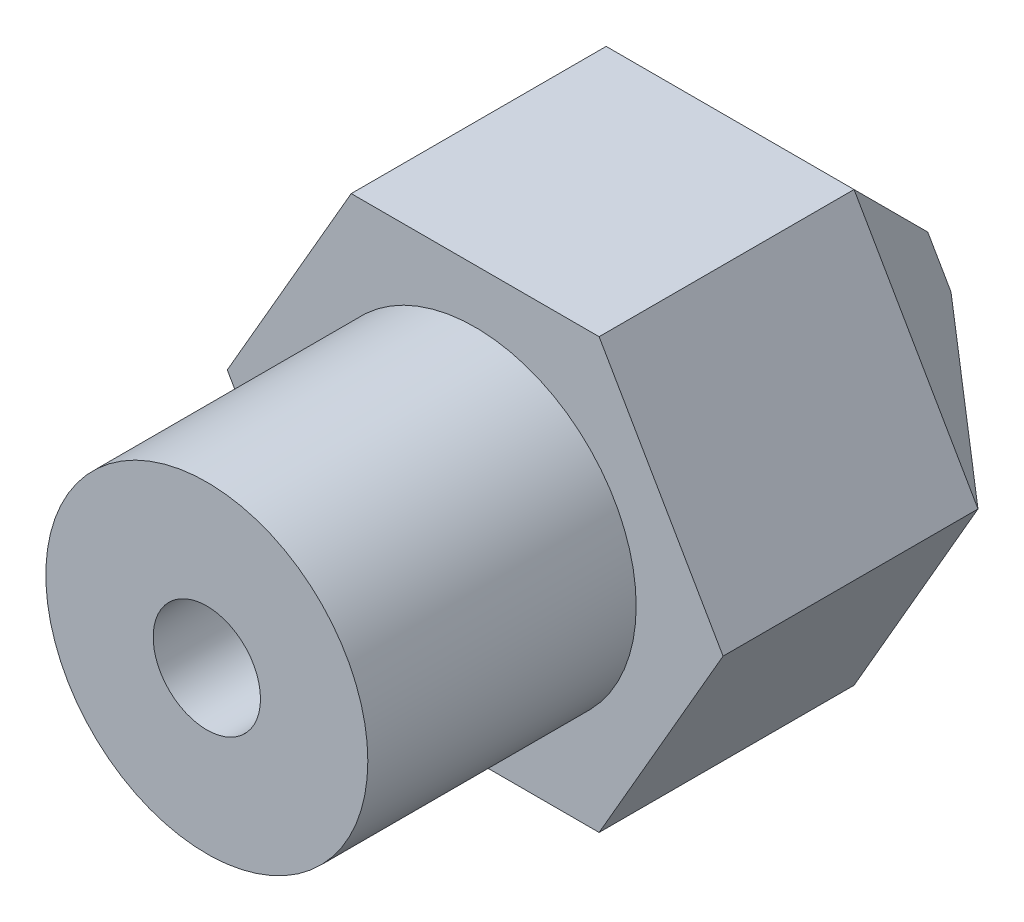
ISO-10303-21;
HEADER;
FILE_DESCRIPTION(('STEP AP214'),'2;1');
FILE_NAME('part.step','',(''),(''),'','','');
FILE_SCHEMA(('AUTOMOTIVE_DESIGN { 1 0 10303 214 1 1 1 1 }'));
ENDSEC;
DATA;
#1=APPLICATION_CONTEXT('core data for automotive mechanical design processes');
#2=APPLICATION_PROTOCOL_DEFINITION('international standard','automotive_design',2000,#1);
#3=PRODUCT_CONTEXT('',#1,'mechanical');
#4=PRODUCT('Part','Part','',(#3));
#5=PRODUCT_RELATED_PRODUCT_CATEGORY('part','',(#4));
#6=PRODUCT_DEFINITION_FORMATION('','',#4);
#7=PRODUCT_DEFINITION_CONTEXT('part definition',#1,'design');
#8=PRODUCT_DEFINITION('design','',#6,#7);
#9=PRODUCT_DEFINITION_SHAPE('','',#8);
#10=(LENGTH_UNIT() NAMED_UNIT(*) SI_UNIT(.MILLI.,.METRE.));
#11=(NAMED_UNIT(*) PLANE_ANGLE_UNIT() SI_UNIT($,.RADIAN.));
#12=(NAMED_UNIT(*) SI_UNIT($,.STERADIAN.) SOLID_ANGLE_UNIT());
#13=UNCERTAINTY_MEASURE_WITH_UNIT(LENGTH_MEASURE(1.E-05),#10,'distance_accuracy_value','');
#14=(GEOMETRIC_REPRESENTATION_CONTEXT(3) GLOBAL_UNCERTAINTY_ASSIGNED_CONTEXT((#13)) GLOBAL_UNIT_ASSIGNED_CONTEXT((#10,
#11,#12)) REPRESENTATION_CONTEXT('',''));
#15=CARTESIAN_POINT('',(0.,0.,0.));
#16=DIRECTION('',(0.,0.,1.));
#17=DIRECTION('',(1.,0.,0.));
#18=AXIS2_PLACEMENT_3D('',#15,#16,#17);
#19=CARTESIAN_POINT('',(2.30940107675855,-3.99999999999998,13.));
#20=DIRECTION('',(-0.866025403784442,0.499999999999995,0.));
#21=DIRECTION('',(-0.499999999999995,-0.866025403784442,0.));
#22=AXIS2_PLACEMENT_3D('',#19,#20,#21);
#23=PLANE('',#22);
#24=DIRECTION('',(0.,0.,-1.));
#25=VECTOR('',#24,1.);
#26=CARTESIAN_POINT('',(2.30940107675855,-3.99999999999998,13.));
#27=LINE('',#26,#25);
#28=CARTESIAN_POINT('',(2.30940107675855,-3.99999999999998,8.));
#29=VERTEX_POINT('',#28);
#30=CARTESIAN_POINT('',(2.30940107675855,-3.99999999999998,3.25));
#31=VERTEX_POINT('',#30);
#32=EDGE_CURVE('E120',#29,#31,#27,.T.);
#33=ORIENTED_EDGE('',*,*,#32,.T.);
#34=DIRECTION('',(0.499999999999995,0.866025403784442,0.));
#35=VECTOR('',#34,1.);
#36=CARTESIAN_POINT('',(2.30940107675855,-3.99999999999998,3.25));
#37=LINE('',#36,#35);
#38=CARTESIAN_POINT('',(4.61880215351701,0.,3.25));
#39=VERTEX_POINT('',#38);
#40=EDGE_CURVE('E11',#31,#39,#37,.T.);
#41=ORIENTED_EDGE('',*,*,#40,.T.);
#42=DIRECTION('',(0.,0.,-1.));
#43=VECTOR('',#42,1.);
#44=CARTESIAN_POINT('',(4.61880215351701,0.,13.));
#45=LINE('',#44,#43);
#46=CARTESIAN_POINT('',(4.61880215351701,0.,8.));
#47=VERTEX_POINT('',#46);
#48=EDGE_CURVE('E116',#47,#39,#45,.T.);
#49=ORIENTED_EDGE('',*,*,#48,.F.);
#50=DIRECTION('',(0.499999999999995,0.866025403784442,0.));
#51=VECTOR('',#50,1.);
#52=CARTESIAN_POINT('',(2.30940107675855,-3.99999999999998,8.));
#53=LINE('',#52,#51);
#54=EDGE_CURVE('E111',#29,#47,#53,.T.);
#55=ORIENTED_EDGE('',*,*,#54,.F.);
#56=EDGE_LOOP('',(#33,#41,#49,#55));
#57=FACE_BOUND('',#56,.T.);
#58=ADVANCED_FACE('F35',(#57),#23,.F.);
#59=CARTESIAN_POINT('',(4.61880215351701,0.,13.));
#60=DIRECTION('',(-0.866025403784438,-0.500000000000001,0.));
#61=DIRECTION('',(0.500000000000001,-0.866025403784438,0.));
#62=AXIS2_PLACEMENT_3D('',#59,#60,#61);
#63=PLANE('',#62);
#64=ORIENTED_EDGE('',*,*,#48,.T.);
#65=DIRECTION('',(-0.500000000000001,0.866025403784438,0.));
#66=VECTOR('',#65,1.);
#67=CARTESIAN_POINT('',(4.61880215351701,0.,3.25));
#68=LINE('',#67,#66);
#69=CARTESIAN_POINT('',(2.3094010767585,4.00000000000001,3.25));
#70=VERTEX_POINT('',#69);
#71=EDGE_CURVE('E115',#39,#70,#68,.T.);
#72=ORIENTED_EDGE('',*,*,#71,.T.);
#73=DIRECTION('',(0.,0.,-1.));
#74=VECTOR('',#73,1.);
#75=CARTESIAN_POINT('',(2.3094010767585,4.00000000000001,13.));
#76=LINE('',#75,#74);
#77=CARTESIAN_POINT('',(2.3094010767585,4.00000000000001,8.));
#78=VERTEX_POINT('',#77);
#79=EDGE_CURVE('E136',#78,#70,#76,.T.);
#80=ORIENTED_EDGE('',*,*,#79,.F.);
#81=DIRECTION('',(-0.500000000000001,0.866025403784438,0.));
#82=VECTOR('',#81,1.);
#83=CARTESIAN_POINT('',(4.61880215351701,0.,8.));
#84=LINE('',#83,#82);
#85=EDGE_CURVE('E123',#47,#78,#84,.T.);
#86=ORIENTED_EDGE('',*,*,#85,.F.);
#87=EDGE_LOOP('',(#64,#72,#80,#86));
#88=FACE_BOUND('',#87,.T.);
#89=ADVANCED_FACE('F200',(#88),#63,.F.);
#90=CARTESIAN_POINT('',(2.3094010767585,4.00000000000001,13.));
#91=DIRECTION('',(0.,-1.,0.));
#92=DIRECTION('',(1.,0.,0.));
#93=AXIS2_PLACEMENT_3D('',#90,#91,#92);
#94=PLANE('',#93);
#95=ORIENTED_EDGE('',*,*,#79,.T.);
#96=DIRECTION('',(-1.,0.,0.));
#97=VECTOR('',#96,1.);
#98=CARTESIAN_POINT('',(2.3094010767585,4.00000000000001,3.25));
#99=LINE('',#98,#97);
#100=CARTESIAN_POINT('',(-2.30940107675852,3.99999999999999,3.25));
#101=VERTEX_POINT('',#100);
#102=EDGE_CURVE('E155',#70,#101,#99,.T.);
#103=ORIENTED_EDGE('',*,*,#102,.T.);
#104=DIRECTION('',(0.,0.,-1.));
#105=VECTOR('',#104,1.);
#106=CARTESIAN_POINT('',(-2.30940107675852,3.99999999999999,13.));
#107=LINE('',#106,#105);
#108=CARTESIAN_POINT('',(-2.30940107675852,3.99999999999999,8.));
#109=VERTEX_POINT('',#108);
#110=EDGE_CURVE('E133',#109,#101,#107,.T.);
#111=ORIENTED_EDGE('',*,*,#110,.F.);
#112=DIRECTION('',(-1.,0.,0.));
#113=VECTOR('',#112,1.);
#114=CARTESIAN_POINT('',(2.3094010767585,4.00000000000001,8.));
#115=LINE('',#114,#113);
#116=EDGE_CURVE('E192',#78,#109,#115,.T.);
#117=ORIENTED_EDGE('',*,*,#116,.F.);
#118=EDGE_LOOP('',(#95,#103,#111,#117));
#119=FACE_BOUND('',#118,.T.);
#120=ADVANCED_FACE('F199',(#119),#94,.F.);
#121=CARTESIAN_POINT('',(-2.30940107675852,3.99999999999999,13.));
#122=DIRECTION('',(0.866025403784441,-0.499999999999995,0.));
#123=DIRECTION('',(0.499999999999995,0.866025403784442,0.));
#124=AXIS2_PLACEMENT_3D('',#121,#122,#123);
#125=PLANE('',#124);
#126=ORIENTED_EDGE('',*,*,#110,.T.);
#127=DIRECTION('',(-0.499999999999995,-0.866025403784442,0.));
#128=VECTOR('',#127,1.);
#129=CARTESIAN_POINT('',(-2.30940107675852,3.99999999999999,3.25));
#130=LINE('',#129,#128);
#131=CARTESIAN_POINT('',(-4.61880215351701,0.,3.25));
#132=VERTEX_POINT('',#131);
#133=EDGE_CURVE('E157',#101,#132,#130,.T.);
#134=ORIENTED_EDGE('',*,*,#133,.T.);
#135=DIRECTION('',(0.,0.,-1.));
#136=VECTOR('',#135,1.);
#137=CARTESIAN_POINT('',(-4.61880215351701,0.,13.));
#138=LINE('',#137,#136);
#139=CARTESIAN_POINT('',(-4.61880215351701,0.,8.));
#140=VERTEX_POINT('',#139);
#141=EDGE_CURVE('E128',#140,#132,#138,.T.);
#142=ORIENTED_EDGE('',*,*,#141,.F.);
#143=DIRECTION('',(-0.499999999999995,-0.866025403784442,0.));
#144=VECTOR('',#143,1.);
#145=CARTESIAN_POINT('',(-2.30940107675852,3.99999999999999,8.));
#146=LINE('',#145,#144);
#147=EDGE_CURVE('E190',#109,#140,#146,.T.);
#148=ORIENTED_EDGE('',*,*,#147,.F.);
#149=EDGE_LOOP('',(#126,#134,#142,#148));
#150=FACE_BOUND('',#149,.T.);
#151=ADVANCED_FACE('F215',(#150),#125,.F.);
#152=CARTESIAN_POINT('',(-4.61880215351701,0.,13.));
#153=DIRECTION('',(0.866025403784434,0.500000000000007,0.));
#154=DIRECTION('',(-0.500000000000007,0.866025403784435,0.));
#155=AXIS2_PLACEMENT_3D('',#152,#153,#154);
#156=PLANE('',#155);
#157=ORIENTED_EDGE('',*,*,#141,.T.);
#158=DIRECTION('',(0.500000000000007,-0.866025403784435,0.));
#159=VECTOR('',#158,1.);
#160=CARTESIAN_POINT('',(-4.61880215351701,0.,3.25));
#161=LINE('',#160,#159);
#162=CARTESIAN_POINT('',(-2.30940107675847,-4.00000000000002,3.25));
#163=VERTEX_POINT('',#162);
#164=EDGE_CURVE('E59',#132,#163,#161,.T.);
#165=ORIENTED_EDGE('',*,*,#164,.T.);
#166=DIRECTION('',(0.,0.,-1.));
#167=VECTOR('',#166,1.);
#168=CARTESIAN_POINT('',(-2.30940107675847,-4.00000000000002,13.));
#169=LINE('',#168,#167);
#170=CARTESIAN_POINT('',(-2.30940107675847,-4.00000000000002,8.));
#171=VERTEX_POINT('',#170);
#172=EDGE_CURVE('E126',#171,#163,#169,.T.);
#173=ORIENTED_EDGE('',*,*,#172,.F.);
#174=DIRECTION('',(0.500000000000007,-0.866025403784435,0.));
#175=VECTOR('',#174,1.);
#176=CARTESIAN_POINT('',(-4.61880215351701,0.,8.));
#177=LINE('',#176,#175);
#178=EDGE_CURVE('E114',#140,#171,#177,.T.);
#179=ORIENTED_EDGE('',*,*,#178,.F.);
#180=EDGE_LOOP('',(#157,#165,#173,#179));
#181=FACE_BOUND('',#180,.T.);
#182=ADVANCED_FACE('F239',(#181),#156,.F.);
#183=CARTESIAN_POINT('',(-2.30940107675847,-4.00000000000002,13.));
#184=DIRECTION('',(0.,1.,0.));
#185=DIRECTION('',(-1.,0.,0.));
#186=AXIS2_PLACEMENT_3D('',#183,#184,#185);
#187=PLANE('',#186);
#188=ORIENTED_EDGE('',*,*,#172,.T.);
#189=DIRECTION('',(1.,0.,0.));
#190=VECTOR('',#189,1.);
#191=CARTESIAN_POINT('',(-2.30940107675847,-4.00000000000002,3.25));
#192=LINE('',#191,#190);
#193=EDGE_CURVE('E44',#163,#31,#192,.T.);
#194=ORIENTED_EDGE('',*,*,#193,.T.);
#195=ORIENTED_EDGE('',*,*,#32,.F.);
#196=DIRECTION('',(1.,0.,0.));
#197=VECTOR('',#196,1.);
#198=CARTESIAN_POINT('',(-2.30940107675847,-4.00000000000002,8.));
#199=LINE('',#198,#197);
#200=EDGE_CURVE('E108',#171,#29,#199,.T.);
#201=ORIENTED_EDGE('',*,*,#200,.F.);
#202=EDGE_LOOP('',(#188,#194,#195,#201));
#203=FACE_BOUND('',#202,.T.);
#204=ADVANCED_FACE('F125',(#203),#187,.F.);
#205=CARTESIAN_POINT('',(0.,0.,0.));
#206=DIRECTION('',(0.,0.,1.));
#207=DIRECTION('',(1.,0.,0.));
#208=AXIS2_PLACEMENT_3D('',#205,#206,#207);
#209=PLANE('',#208);
#210=CARTESIAN_POINT('',(0.,0.,0.));
#211=DIRECTION('',(0.,0.,-1.));
#212=DIRECTION('',(-1.,0.,0.));
#213=AXIS2_PLACEMENT_3D('',#210,#211,#212);
#214=CIRCLE('',#213,0.2);
#215=CARTESIAN_POINT('',(-0.2,0.,0.));
#216=VERTEX_POINT('',#215);
#217=EDGE_CURVE('E297',#216,#216,#214,.T.);
#218=ORIENTED_EDGE('',*,*,#217,.F.);
#219=EDGE_LOOP('',(#218));
#220=FACE_BOUND('',#219,.T.);
#221=DIRECTION('',(1.,0.,0.));
#222=VECTOR('',#221,1.);
#223=CARTESIAN_POINT('',(0.,0.74999999999999,0.));
#224=LINE('',#223,#222);
#225=CARTESIAN_POINT('',(-0.433012701892217,0.749999999999988,0.));
#226=VERTEX_POINT('',#225);
#227=CARTESIAN_POINT('',(0.433012701892211,0.749999999999991,0.));
#228=VERTEX_POINT('',#227);
#229=EDGE_CURVE('E150',#226,#228,#224,.T.);
#230=ORIENTED_EDGE('',*,*,#229,.T.);
#231=DIRECTION('',(0.500000000000001,-0.866025403784438,0.));
#232=VECTOR('',#231,1.);
#233=CARTESIAN_POINT('',(0.649519052838319,0.374999999999995,0.));
#234=LINE('',#233,#232);
#235=CARTESIAN_POINT('',(0.866025403784433,0.,0.));
#236=VERTEX_POINT('',#235);
#237=EDGE_CURVE('E152',#228,#236,#234,.T.);
#238=ORIENTED_EDGE('',*,*,#237,.T.);
#239=DIRECTION('',(-0.499999999999995,-0.866025403784442,0.));
#240=VECTOR('',#239,1.);
#241=CARTESIAN_POINT('',(0.649519052838335,-0.374999999999998,0.));
#242=LINE('',#241,#240);
#243=CARTESIAN_POINT('',(0.433012701892235,-0.749999999999985,0.));
#244=VERTEX_POINT('',#243);
#245=EDGE_CURVE('E142',#236,#244,#242,.T.);
#246=ORIENTED_EDGE('',*,*,#245,.T.);
#247=DIRECTION('',(-1.,0.,0.));
#248=VECTOR('',#247,1.);
#249=CARTESIAN_POINT('',(0.,-0.74999999999999,0.));
#250=LINE('',#249,#248);
#251=CARTESIAN_POINT('',(-0.433012701892206,-0.749999999999994,0.));
#252=VERTEX_POINT('',#251);
#253=EDGE_CURVE('E144',#244,#252,#250,.T.);
#254=ORIENTED_EDGE('',*,*,#253,.T.);
#255=DIRECTION('',(-0.500000000000007,0.866025403784435,0.));
#256=VECTOR('',#255,1.);
#257=CARTESIAN_POINT('',(-0.649519052838317,-0.375,0.));
#258=LINE('',#257,#256);
#259=CARTESIAN_POINT('',(-0.866025403784427,0.,0.));
#260=VERTEX_POINT('',#259);
#261=EDGE_CURVE('E146',#252,#260,#258,.T.);
#262=ORIENTED_EDGE('',*,*,#261,.T.);
#263=DIRECTION('',(0.499999999999995,0.866025403784442,0.));
#264=VECTOR('',#263,1.);
#265=CARTESIAN_POINT('',(-0.649519052838322,0.374999999999991,0.));
#266=LINE('',#265,#264);
#267=EDGE_CURVE('E148',#260,#226,#266,.T.);
#268=ORIENTED_EDGE('',*,*,#267,.T.);
#269=EDGE_LOOP('',(#230,#238,#246,#254,#262,#268));
#270=FACE_BOUND('',#269,.T.);
#271=ADVANCED_FACE('F228',(#220,#270),#209,.F.);
#272=CARTESIAN_POINT('',(0.,0.,8.));
#273=DIRECTION('',(0.,0.,1.));
#274=DIRECTION('',(1.,0.,0.));
#275=AXIS2_PLACEMENT_3D('',#272,#273,#274);
#276=PLANE('',#275);
#277=CARTESIAN_POINT('',(0.,0.,8.));
#278=DIRECTION('',(0.,0.,1.));
#279=DIRECTION('',(1.,0.,0.));
#280=AXIS2_PLACEMENT_3D('',#277,#278,#279);
#281=CIRCLE('',#280,3.);
#282=CARTESIAN_POINT('',(3.,0.,8.));
#283=VERTEX_POINT('',#282);
#284=EDGE_CURVE('E181',#283,#283,#281,.T.);
#285=ORIENTED_EDGE('',*,*,#284,.F.);
#286=EDGE_LOOP('',(#285));
#287=FACE_BOUND('',#286,.T.);
#288=ORIENTED_EDGE('',*,*,#54,.T.);
#289=ORIENTED_EDGE('',*,*,#85,.T.);
#290=ORIENTED_EDGE('',*,*,#116,.T.);
#291=ORIENTED_EDGE('',*,*,#147,.T.);
#292=ORIENTED_EDGE('',*,*,#178,.T.);
#293=ORIENTED_EDGE('',*,*,#200,.T.);
#294=EDGE_LOOP('',(#288,#289,#290,#291,#292,#293));
#295=FACE_BOUND('',#294,.T.);
#296=ADVANCED_FACE('F110',(#287,#295),#276,.T.);
#297=CARTESIAN_POINT('',(0.,0.,8.));
#298=DIRECTION('',(0.,0.,1.));
#299=DIRECTION('',(1.,0.,0.));
#300=AXIS2_PLACEMENT_3D('',#297,#298,#299);
#301=CYLINDRICAL_SURFACE('',#300,3.);
#302=ORIENTED_EDGE('',*,*,#284,.T.);
#303=EDGE_LOOP('',(#302));
#304=FACE_BOUND('',#303,.T.);
#305=CARTESIAN_POINT('',(0.,0.,13.));
#306=DIRECTION('',(0.,0.,1.));
#307=DIRECTION('',(1.,0.,0.));
#308=AXIS2_PLACEMENT_3D('',#305,#306,#307);
#309=CIRCLE('',#308,3.);
#310=CARTESIAN_POINT('',(3.,0.,13.));
#311=VERTEX_POINT('',#310);
#312=EDGE_CURVE('E176',#311,#311,#309,.T.);
#313=ORIENTED_EDGE('',*,*,#312,.F.);
#314=EDGE_LOOP('',(#313));
#315=FACE_BOUND('',#314,.T.);
#316=ADVANCED_FACE('F236',(#304,#315),#301,.T.);
#317=CARTESIAN_POINT('',(0.,0.,13.));
#318=DIRECTION('',(0.,0.,1.));
#319=DIRECTION('',(1.,0.,0.));
#320=AXIS2_PLACEMENT_3D('',#317,#318,#319);
#321=PLANE('',#320);
#322=CARTESIAN_POINT('',(0.,0.,13.));
#323=DIRECTION('',(0.,0.,1.));
#324=DIRECTION('',(1.,0.,0.));
#325=AXIS2_PLACEMENT_3D('',#322,#323,#324);
#326=CIRCLE('',#325,0.999999999999999);
#327=CARTESIAN_POINT('',(0.999999999999999,0.,13.));
#328=VERTEX_POINT('',#327);
#329=EDGE_CURVE('E301',#328,#328,#326,.T.);
#330=ORIENTED_EDGE('',*,*,#329,.F.);
#331=EDGE_LOOP('',(#330));
#332=FACE_BOUND('',#331,.T.);
#333=ORIENTED_EDGE('',*,*,#312,.T.);
#334=EDGE_LOOP('',(#333));
#335=FACE_BOUND('',#334,.T.);
#336=ADVANCED_FACE('F263',(#332,#335),#321,.T.);
#337=CARTESIAN_POINT('',(-4.61880215351701,0.,3.25));
#338=DIRECTION('',(0.612372435695791,0.353553390593278,0.707106781186549));
#339=DIRECTION('',(0.500000000000007,-0.866025403784435,0.));
#340=AXIS2_PLACEMENT_3D('',#337,#338,#339);
#341=PLANE('',#340);
#342=DIRECTION('',(0.755928946018456,0.,-0.654653670707975));
#343=VECTOR('',#342,1.);
#344=CARTESIAN_POINT('',(-4.61880215351701,0.,3.25));
#345=LINE('',#344,#343);
#346=EDGE_CURVE('E172',#260,#132,#345,.F.);
#347=ORIENTED_EDGE('',*,*,#346,.F.);
#348=ORIENTED_EDGE('',*,*,#261,.F.);
#349=DIRECTION('',(0.377964473009222,0.654653670707982,-0.654653670707976));
#350=VECTOR('',#349,1.);
#351=CARTESIAN_POINT('',(-2.30940107675847,-4.00000000000002,3.25));
#352=LINE('',#351,#350);
#353=EDGE_CURVE('E174',#163,#252,#352,.T.);
#354=ORIENTED_EDGE('',*,*,#353,.F.);
#355=ORIENTED_EDGE('',*,*,#164,.F.);
#356=EDGE_LOOP('',(#347,#348,#354,#355));
#357=FACE_BOUND('',#356,.T.);
#358=ADVANCED_FACE('F37',(#357),#341,.F.);
#359=CARTESIAN_POINT('',(-2.30940107675847,-4.00000000000002,3.25));
#360=DIRECTION('',(0.,0.707106781186546,0.707106781186549));
#361=DIRECTION('',(1.,0.,0.));
#362=AXIS2_PLACEMENT_3D('',#359,#360,#361);
#363=PLANE('',#362);
#364=ORIENTED_EDGE('',*,*,#353,.T.);
#365=ORIENTED_EDGE('',*,*,#253,.F.);
#366=DIRECTION('',(-0.377964473009233,0.654653670707975,-0.654653670707976));
#367=VECTOR('',#366,1.);
#368=CARTESIAN_POINT('',(2.30940107675855,-3.99999999999998,3.25));
#369=LINE('',#368,#367);
#370=EDGE_CURVE('E169',#31,#244,#369,.T.);
#371=ORIENTED_EDGE('',*,*,#370,.F.);
#372=ORIENTED_EDGE('',*,*,#193,.F.);
#373=EDGE_LOOP('',(#364,#365,#371,#372));
#374=FACE_BOUND('',#373,.T.);
#375=ADVANCED_FACE('F223',(#374),#363,.F.);
#376=CARTESIAN_POINT('',(-2.30940107675852,3.99999999999999,3.25));
#377=DIRECTION('',(0.612372435695795,-0.35355339059327,0.707106781186549));
#378=DIRECTION('',(-0.499999999999995,-0.866025403784442,0.));
#379=AXIS2_PLACEMENT_3D('',#376,#377,#378);
#380=PLANE('',#379);
#381=ORIENTED_EDGE('',*,*,#346,.T.);
#382=ORIENTED_EDGE('',*,*,#133,.F.);
#383=DIRECTION('',(0.377964473009231,-0.654653670707977,-0.654653670707976));
#384=VECTOR('',#383,1.);
#385=CARTESIAN_POINT('',(-2.30940107675852,3.99999999999999,3.25));
#386=LINE('',#385,#384);
#387=EDGE_CURVE('E166',#226,#101,#386,.F.);
#388=ORIENTED_EDGE('',*,*,#387,.F.);
#389=ORIENTED_EDGE('',*,*,#267,.F.);
#390=EDGE_LOOP('',(#381,#382,#388,#389));
#391=FACE_BOUND('',#390,.T.);
#392=ADVANCED_FACE('F218',(#391),#380,.F.);
#393=CARTESIAN_POINT('',(2.30940107675855,-3.99999999999998,3.25));
#394=DIRECTION('',(-0.612372435695795,0.353553390593269,0.707106781186549));
#395=DIRECTION('',(0.499999999999995,0.866025403784442,0.));
#396=AXIS2_PLACEMENT_3D('',#393,#394,#395);
#397=PLANE('',#396);
#398=ORIENTED_EDGE('',*,*,#370,.T.);
#399=ORIENTED_EDGE('',*,*,#245,.F.);
#400=DIRECTION('',(0.755928946018455,0.,0.654653670707976));
#401=VECTOR('',#400,1.);
#402=CARTESIAN_POINT('',(3.29914439536931,0.,2.10714285714287));
#403=LINE('',#402,#401);
#404=EDGE_CURVE('E163',#39,#236,#403,.F.);
#405=ORIENTED_EDGE('',*,*,#404,.F.);
#406=ORIENTED_EDGE('',*,*,#40,.F.);
#407=EDGE_LOOP('',(#398,#399,#405,#406));
#408=FACE_BOUND('',#407,.T.);
#409=ADVANCED_FACE('F226',(#408),#397,.F.);
#410=CARTESIAN_POINT('',(2.3094010767585,4.00000000000001,3.25));
#411=DIRECTION('',(0.,-0.707106781186546,0.707106781186549));
#412=DIRECTION('',(-1.,0.,0.));
#413=AXIS2_PLACEMENT_3D('',#410,#411,#412);
#414=PLANE('',#413);
#415=ORIENTED_EDGE('',*,*,#387,.T.);
#416=ORIENTED_EDGE('',*,*,#102,.F.);
#417=DIRECTION('',(-0.377964473009226,-0.654653670707979,-0.654653670707976));
#418=VECTOR('',#417,1.);
#419=CARTESIAN_POINT('',(2.3094010767585,4.00000000000001,3.25));
#420=LINE('',#419,#418);
#421=EDGE_CURVE('E161',#228,#70,#420,.F.);
#422=ORIENTED_EDGE('',*,*,#421,.F.);
#423=ORIENTED_EDGE('',*,*,#229,.F.);
#424=EDGE_LOOP('',(#415,#416,#422,#423));
#425=FACE_BOUND('',#424,.T.);
#426=ADVANCED_FACE('F211',(#425),#414,.F.);
#427=CARTESIAN_POINT('',(4.61880215351701,0.,3.25));
#428=DIRECTION('',(-0.612372435695793,-0.353553390593274,0.707106781186549));
#429=DIRECTION('',(-0.500000000000001,0.866025403784438,0.));
#430=AXIS2_PLACEMENT_3D('',#427,#428,#429);
#431=PLANE('',#430);
#432=ORIENTED_EDGE('',*,*,#404,.T.);
#433=ORIENTED_EDGE('',*,*,#237,.F.);
#434=ORIENTED_EDGE('',*,*,#421,.T.);
#435=ORIENTED_EDGE('',*,*,#71,.F.);
#436=EDGE_LOOP('',(#432,#433,#434,#435));
#437=FACE_BOUND('',#436,.T.);
#438=ADVANCED_FACE('F204',(#437),#431,.F.);
#439=CARTESIAN_POINT('',(0.,0.,2.4));
#440=DIRECTION('',(0.,0.,1.));
#441=DIRECTION('',(1.,0.,0.));
#442=AXIS2_PLACEMENT_3D('',#439,#440,#441);
#443=CONICAL_SURFACE('',#442,0.999999999999997,1.02974425867665);
#444=CARTESIAN_POINT('',(0.,0.,2.4));
#445=DIRECTION('',(0.,0.,1.));
#446=DIRECTION('',(1.,0.,0.));
#447=AXIS2_PLACEMENT_3D('',#444,#445,#446);
#448=CIRCLE('',#447,0.999999999999997);
#449=CARTESIAN_POINT('',(0.999999999999997,0.,2.4));
#450=VERTEX_POINT('',#449);
#451=EDGE_CURVE('E304',#450,#450,#448,.T.);
#452=ORIENTED_EDGE('',*,*,#451,.T.);
#453=EDGE_LOOP('',(#452));
#454=FACE_BOUND('',#453,.T.);
#455=CARTESIAN_POINT('',(0.,0.,2.24978484524311));
#456=DIRECTION('',(0.,0.,1.));
#457=DIRECTION('',(1.,0.,0.));
#458=AXIS2_PLACEMENT_3D('',#455,#456,#457);
#459=CIRCLE('',#458,0.749999999999999);
#460=CARTESIAN_POINT('',(0.749999999999999,0.,2.24978484524311));
#461=VERTEX_POINT('',#460);
#462=EDGE_CURVE('E39',#461,#461,#459,.T.);
#463=ORIENTED_EDGE('',*,*,#462,.F.);
#464=EDGE_LOOP('',(#463));
#465=FACE_BOUND('',#464,.T.);
#466=ADVANCED_FACE('F253',(#454,#465),#443,.F.);
#467=CARTESIAN_POINT('',(0.,0.,13.));
#468=DIRECTION('',(0.,0.,1.));
#469=DIRECTION('',(1.,0.,0.));
#470=AXIS2_PLACEMENT_3D('',#467,#468,#469);
#471=CYLINDRICAL_SURFACE('',#470,0.999999999999998);
#472=ORIENTED_EDGE('',*,*,#451,.F.);
#473=EDGE_LOOP('',(#472));
#474=FACE_BOUND('',#473,.T.);
#475=ORIENTED_EDGE('',*,*,#329,.T.);
#476=EDGE_LOOP('',(#475));
#477=FACE_BOUND('',#476,.T.);
#478=ADVANCED_FACE('F279',(#474,#477),#471,.F.);
#479=CARTESIAN_POINT('',(0.,0.,0.9));
#480=DIRECTION('',(0.,0.,1.));
#481=DIRECTION('',(1.,0.,0.));
#482=AXIS2_PLACEMENT_3D('',#479,#480,#481);
#483=CONICAL_SURFACE('',#482,0.749999999999998,1.02974425867665);
#484=CARTESIAN_POINT('',(0.,0.,0.569526659534839));
#485=DIRECTION('',(0.,0.,1.));
#486=DIRECTION('',(1.,0.,0.));
#487=AXIS2_PLACEMENT_3D('',#484,#485,#486);
#488=CIRCLE('',#487,0.2);
#489=CARTESIAN_POINT('',(0.2,0.,0.569526659534839));
#490=VERTEX_POINT('',#489);
#491=EDGE_CURVE('E300',#490,#490,#488,.F.);
#492=CARTESIAN_POINT('',(0.,0.,0.9));
#493=DIRECTION('',(0.,0.,1.));
#494=DIRECTION('',(1.,0.,0.));
#495=AXIS2_PLACEMENT_3D('',#492,#493,#494);
#496=CIRCLE('',#495,0.749999999999998);
#497=CARTESIAN_POINT('',(0.749999999999998,0.,0.9));
#498=VERTEX_POINT('',#497);
#499=EDGE_CURVE('E164',#498,#498,#496,.T.);
#500=CARTESIAN_POINT('',(0.2,0.,0.569526659534839));
#501=CARTESIAN_POINT('',(0.205729166666666,0.,0.572969090164685));
#502=CARTESIAN_POINT('',(0.211458333333333,0.,0.57641152079453));
#503=CARTESIAN_POINT('',(0.222916666666666,0.,0.583296382054221));
#504=CARTESIAN_POINT('',(0.228645833333333,0.,0.586738812684066));
#505=CARTESIAN_POINT('',(0.240104166666666,0.,0.593623673943757));
#506=CARTESIAN_POINT('',(0.245833333333333,0.,0.597066104573602));
#507=CARTESIAN_POINT('',(0.257291666666666,0.,0.603950965833293));
#508=CARTESIAN_POINT('',(0.263020833333333,0.,0.607393396463139));
#509=CARTESIAN_POINT('',(0.274479166666666,0.,0.61427825772283));
#510=CARTESIAN_POINT('',(0.280208333333333,0.,0.617720688352675));
#511=CARTESIAN_POINT('',(0.291666666666666,0.,0.624605549612366));
#512=CARTESIAN_POINT('',(0.297395833333333,0.,0.628047980242211));
#513=CARTESIAN_POINT('',(0.308854166666666,0.,0.634932841501902));
#514=CARTESIAN_POINT('',(0.314583333333333,0.,0.638375272131747));
#515=CARTESIAN_POINT('',(0.326041666666666,0.,0.645260133391438));
#516=CARTESIAN_POINT('',(0.331770833333333,0.,0.648702564021284));
#517=CARTESIAN_POINT('',(0.343229166666666,0.,0.655587425280975));
#518=CARTESIAN_POINT('',(0.348958333333332,0.,0.65902985591082));
#519=CARTESIAN_POINT('',(0.360416666666666,0.,0.665914717170511));
#520=CARTESIAN_POINT('',(0.366145833333332,0.,0.669357147800356));
#521=CARTESIAN_POINT('',(0.377604166666666,0.,0.676242009060047));
#522=CARTESIAN_POINT('',(0.383333333333332,0.,0.679684439689893));
#523=CARTESIAN_POINT('',(0.394791666666666,0.,0.686569300949583));
#524=CARTESIAN_POINT('',(0.400520833333332,0.,0.690011731579429));
#525=CARTESIAN_POINT('',(0.411979166666666,0.,0.69689659283912));
#526=CARTESIAN_POINT('',(0.417708333333332,0.,0.700339023468965));
#527=CARTESIAN_POINT('',(0.429166666666666,0.,0.707223884728656));
#528=CARTESIAN_POINT('',(0.434895833333332,0.,0.710666315358501));
#529=CARTESIAN_POINT('',(0.446354166666666,0.,0.717551176618192));
#530=CARTESIAN_POINT('',(0.452083333333332,0.,0.720993607248038));
#531=CARTESIAN_POINT('',(0.463541666666665,0.,0.727878468507729));
#532=CARTESIAN_POINT('',(0.469270833333332,0.,0.731320899137574));
#533=CARTESIAN_POINT('',(0.480729166666665,0.,0.738205760397265));
#534=CARTESIAN_POINT('',(0.486458333333332,0.,0.74164819102711));
#535=CARTESIAN_POINT('',(0.497916666666665,0.,0.748533052286801));
#536=CARTESIAN_POINT('',(0.503645833333332,0.,0.751975482916646));
#537=CARTESIAN_POINT('',(0.515104166666665,0.,0.758860344176337));
#538=CARTESIAN_POINT('',(0.520833333333332,0.,0.762302774806183));
#539=CARTESIAN_POINT('',(0.532291666666665,0.,0.769187636065874));
#540=CARTESIAN_POINT('',(0.538020833333332,0.,0.772630066695719));
#541=CARTESIAN_POINT('',(0.549479166666665,0.,0.77951492795541));
#542=CARTESIAN_POINT('',(0.555208333333332,0.,0.782957358585255));
#543=CARTESIAN_POINT('',(0.566666666666665,0.,0.789842219844946));
#544=CARTESIAN_POINT('',(0.572395833333332,0.,0.793284650474792));
#545=CARTESIAN_POINT('',(0.583854166666665,0.,0.800169511734482));
#546=CARTESIAN_POINT('',(0.589583333333332,0.,0.803611942364328));
#547=CARTESIAN_POINT('',(0.601041666666665,0.,0.810496803624019));
#548=CARTESIAN_POINT('',(0.606770833333332,0.,0.813939234253864));
#549=CARTESIAN_POINT('',(0.618229166666665,0.,0.820824095513555));
#550=CARTESIAN_POINT('',(0.623958333333332,0.,0.8242665261434));
#551=CARTESIAN_POINT('',(0.635416666666665,0.,0.831151387403091));
#552=CARTESIAN_POINT('',(0.641145833333332,0.,0.834593818032937));
#553=CARTESIAN_POINT('',(0.652604166666665,0.,0.841478679292628));
#554=CARTESIAN_POINT('',(0.658333333333332,0.,0.844921109922473));
#555=CARTESIAN_POINT('',(0.669791666666665,0.,0.851805971182164));
#556=CARTESIAN_POINT('',(0.675520833333332,0.,0.855248401812009));
#557=CARTESIAN_POINT('',(0.686979166666665,0.,0.8621332630717));
#558=CARTESIAN_POINT('',(0.692708333333331,0.,0.865575693701546));
#559=CARTESIAN_POINT('',(0.704166666666665,0.,0.872460554961236));
#560=CARTESIAN_POINT('',(0.709895833333332,0.,0.875902985591082));
#561=CARTESIAN_POINT('',(0.721354166666665,0.,0.882787846850773));
#562=CARTESIAN_POINT('',(0.727083333333331,0.,0.886230277480618));
#563=CARTESIAN_POINT('',(0.738541666666665,0.,0.893115138740309));
#564=CARTESIAN_POINT('',(0.744270833333331,0.,0.896557569370154));
#565=CARTESIAN_POINT('',(0.749999999999998,0.,0.9));
#566=B_SPLINE_CURVE_WITH_KNOTS('',3,(#500,#501,#502,#503,#504,#505,#506,#507,#508,#509,#510,
#511,#512,#513,#514,#515,#516,#517,#518,#519,#520,#521,#522,#523,#524,#525,#526,#527,#528,#529,
#530,#531,#532,#533,#534,#535,#536,#537,#538,#539,#540,#541,#542,#543,#544,#545,#546,#547,#548,
#549,#550,#551,#552,#553,#554,#555,#556,#557,#558,#559,#560,#561,#562,#563,#564,#565),
.UNSPECIFIED.,.F.,.F.,(4,2,2,2,2,2,2,2,2,2,2,2,2,2,2,2,2,2,2,2,2,2,2,2,2,2,2,2,2,2,2,2,4),(0.,
0.0200515115146385,0.040103023029277,0.0601545345439155,0.080206046058554,0.100257557573193,
0.120309069087831,0.140360580602469,0.160412092117108,0.180463603631746,0.200515115146385,
0.220566626661023,0.240618138175662,0.2606696496903,0.280721161204939,0.300772672719577,
0.320824184234216,0.340875695748854,0.360927207263493,0.380978718778131,0.40103023029277,
0.421081741807408,0.441133253322047,0.461184764836685,0.481236276351324,0.501287787865962,
0.521339299380601,0.541390810895239,0.561442322409878,0.581493833924516,0.601545345439155,
0.621596856953793,0.641648368468432),.UNSPECIFIED.);
#567=EDGE_CURVE('BSEAM275',#490,#498,#566,.T.);
#568=ORIENTED_EDGE('',*,*,#491,.T.);
#569=ORIENTED_EDGE('',*,*,#499,.T.);
#570=ORIENTED_EDGE('',*,*,#567,.T.);
#571=ORIENTED_EDGE('',*,*,#567,.F.);
#572=EDGE_LOOP('',(#568,#570,#569,#571));
#573=FACE_BOUND('',#572,.T.);
#574=ADVANCED_FACE('F275',(#573),#483,.F.);
#575=CARTESIAN_POINT('',(0.,0.,13.));
#576=DIRECTION('',(0.,0.,1.));
#577=DIRECTION('',(1.,0.,0.));
#578=AXIS2_PLACEMENT_3D('',#575,#576,#577);
#579=CYLINDRICAL_SURFACE('',#578,0.749999999999999);
#580=ORIENTED_EDGE('',*,*,#462,.T.);
#581=EDGE_LOOP('',(#580));
#582=FACE_BOUND('',#581,.T.);
#583=ORIENTED_EDGE('',*,*,#499,.F.);
#584=EDGE_LOOP('',(#583));
#585=FACE_BOUND('',#584,.T.);
#586=ADVANCED_FACE('F278',(#582,#585),#579,.F.);
#587=CARTESIAN_POINT('',(0.,0.,0.));
#588=DIRECTION('',(0.,0.,-1.));
#589=DIRECTION('',(-1.,0.,0.));
#590=AXIS2_PLACEMENT_3D('',#587,#588,#589);
#591=CYLINDRICAL_SURFACE('',#590,0.2);
#592=ORIENTED_EDGE('',*,*,#217,.T.);
#593=EDGE_LOOP('',(#592));
#594=FACE_BOUND('',#593,.T.);
#595=ORIENTED_EDGE('',*,*,#491,.F.);
#596=EDGE_LOOP('',(#595));
#597=FACE_BOUND('',#596,.T.);
#598=ADVANCED_FACE('F283',(#594,#597),#591,.F.);
#599=CLOSED_SHELL('',(#58,#89,#120,#151,#182,#204,#271,#296,#316,#336,#358,#375,#392,#409,#426,
#438,#466,#478,#574,#586,#598));
#600=MANIFOLD_SOLID_BREP('B2',#599);
#601=ADVANCED_BREP_SHAPE_REPRESENTATION('',(#18,#600),#14);
#602=SHAPE_DEFINITION_REPRESENTATION(#9,#601);
ENDSEC;
END-ISO-10303-21;
